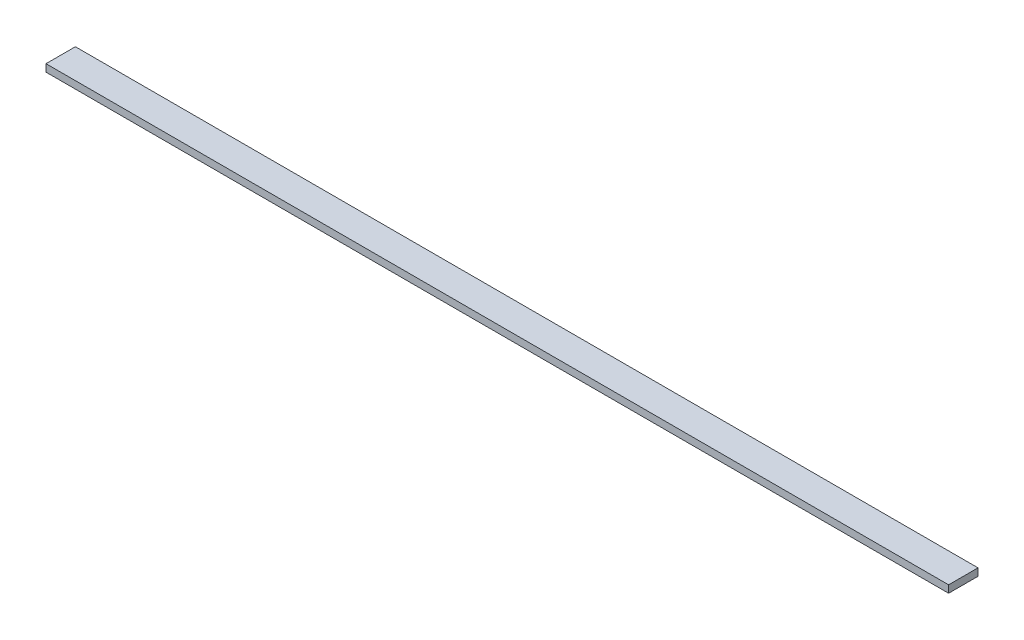
ISO-10303-21;
HEADER;
FILE_DESCRIPTION(('STEP AP214'),'2;1');
FILE_NAME('part.step','',(''),(''),'','','');
FILE_SCHEMA(('AUTOMOTIVE_DESIGN { 1 0 10303 214 1 1 1 1 }'));
ENDSEC;
DATA;
#1=APPLICATION_CONTEXT('core data for automotive mechanical design processes');
#2=APPLICATION_PROTOCOL_DEFINITION('international standard','automotive_design',2000,#1);
#3=PRODUCT_CONTEXT('',#1,'mechanical');
#4=PRODUCT('Part','Part','',(#3));
#5=PRODUCT_RELATED_PRODUCT_CATEGORY('part','',(#4));
#6=PRODUCT_DEFINITION_FORMATION('','',#4);
#7=PRODUCT_DEFINITION_CONTEXT('part definition',#1,'design');
#8=PRODUCT_DEFINITION('design','',#6,#7);
#9=PRODUCT_DEFINITION_SHAPE('','',#8);
#10=(LENGTH_UNIT() NAMED_UNIT(*) SI_UNIT(.MILLI.,.METRE.));
#11=(NAMED_UNIT(*) PLANE_ANGLE_UNIT() SI_UNIT($,.RADIAN.));
#12=(NAMED_UNIT(*) SI_UNIT($,.STERADIAN.) SOLID_ANGLE_UNIT());
#13=UNCERTAINTY_MEASURE_WITH_UNIT(LENGTH_MEASURE(1.E-05),#10,'distance_accuracy_value','');
#14=(GEOMETRIC_REPRESENTATION_CONTEXT(3) GLOBAL_UNCERTAINTY_ASSIGNED_CONTEXT((#13)) GLOBAL_UNIT_ASSIGNED_CONTEXT((#10,
#11,#12)) REPRESENTATION_CONTEXT('',''));
#15=CARTESIAN_POINT('',(0.,0.,0.));
#16=DIRECTION('',(0.,0.,1.));
#17=DIRECTION('',(1.,0.,0.));
#18=AXIS2_PLACEMENT_3D('',#15,#16,#17);
#19=CARTESIAN_POINT('',(292.55,-2.38125,-9.525));
#20=DIRECTION('',(0.,0.,1.));
#21=DIRECTION('',(1.,0.,0.));
#22=AXIS2_PLACEMENT_3D('',#19,#20,#21);
#23=PLANE('',#22);
#24=DIRECTION('',(0.,1.,0.));
#25=VECTOR('',#24,1.);
#26=CARTESIAN_POINT('',(-292.55,-2.38125,-9.525));
#27=LINE('',#26,#25);
#28=CARTESIAN_POINT('',(-292.55,-2.38125,-9.525));
#29=VERTEX_POINT('',#28);
#30=CARTESIAN_POINT('',(-292.55,2.38125,-9.525));
#31=VERTEX_POINT('',#30);
#32=EDGE_CURVE('E102',#29,#31,#27,.T.);
#33=ORIENTED_EDGE('',*,*,#32,.T.);
#34=DIRECTION('',(-1.,0.,0.));
#35=VECTOR('',#34,1.);
#36=CARTESIAN_POINT('',(292.55,2.38125,-9.525));
#37=LINE('',#36,#35);
#38=CARTESIAN_POINT('',(292.55,2.38125,-9.525));
#39=VERTEX_POINT('',#38);
#40=EDGE_CURVE('E11',#39,#31,#37,.T.);
#41=ORIENTED_EDGE('',*,*,#40,.F.);
#42=DIRECTION('',(0.,1.,0.));
#43=VECTOR('',#42,1.);
#44=CARTESIAN_POINT('',(292.55,-2.38125,-9.525));
#45=LINE('',#44,#43);
#46=CARTESIAN_POINT('',(292.55,-2.38125,-9.525));
#47=VERTEX_POINT('',#46);
#48=EDGE_CURVE('E90',#47,#39,#45,.T.);
#49=ORIENTED_EDGE('',*,*,#48,.F.);
#50=DIRECTION('',(-1.,0.,0.));
#51=VECTOR('',#50,1.);
#52=CARTESIAN_POINT('',(292.55,-2.38125,-9.525));
#53=LINE('',#52,#51);
#54=EDGE_CURVE('E98',#47,#29,#53,.T.);
#55=ORIENTED_EDGE('',*,*,#54,.T.);
#56=EDGE_LOOP('',(#33,#41,#49,#55));
#57=FACE_BOUND('',#56,.T.);
#58=ADVANCED_FACE('F39',(#57),#23,.F.);
#59=CARTESIAN_POINT('',(292.55,2.38125,9.525));
#60=DIRECTION('',(0.,-1.,0.));
#61=DIRECTION('',(0.,0.,-1.));
#62=AXIS2_PLACEMENT_3D('',#59,#60,#61);
#63=PLANE('',#62);
#64=DIRECTION('',(0.,0.,1.));
#65=VECTOR('',#64,1.);
#66=CARTESIAN_POINT('',(-292.55,2.38125,9.525));
#67=LINE('',#66,#65);
#68=CARTESIAN_POINT('',(-292.55,2.38125,9.525));
#69=VERTEX_POINT('',#68);
#70=EDGE_CURVE('E94',#31,#69,#67,.T.);
#71=ORIENTED_EDGE('',*,*,#70,.T.);
#72=DIRECTION('',(-1.,0.,0.));
#73=VECTOR('',#72,1.);
#74=CARTESIAN_POINT('',(292.55,2.38125,9.525));
#75=LINE('',#74,#73);
#76=CARTESIAN_POINT('',(292.55,2.38125,9.525));
#77=VERTEX_POINT('',#76);
#78=EDGE_CURVE('E47',#77,#69,#75,.T.);
#79=ORIENTED_EDGE('',*,*,#78,.F.);
#80=DIRECTION('',(0.,0.,1.));
#81=VECTOR('',#80,1.);
#82=CARTESIAN_POINT('',(292.55,2.38125,9.525));
#83=LINE('',#82,#81);
#84=EDGE_CURVE('E85',#39,#77,#83,.T.);
#85=ORIENTED_EDGE('',*,*,#84,.F.);
#86=ORIENTED_EDGE('',*,*,#40,.T.);
#87=EDGE_LOOP('',(#71,#79,#85,#86));
#88=FACE_BOUND('',#87,.T.);
#89=ADVANCED_FACE('F93',(#88),#63,.F.);
#90=CARTESIAN_POINT('',(292.55,-2.38125,9.525));
#91=DIRECTION('',(0.,0.,-1.));
#92=DIRECTION('',(-1.,0.,0.));
#93=AXIS2_PLACEMENT_3D('',#90,#91,#92);
#94=PLANE('',#93);
#95=DIRECTION('',(0.,-1.,0.));
#96=VECTOR('',#95,1.);
#97=CARTESIAN_POINT('',(-292.55,-2.38125,9.525));
#98=LINE('',#97,#96);
#99=CARTESIAN_POINT('',(-292.55,-2.38125,9.525));
#100=VERTEX_POINT('',#99);
#101=EDGE_CURVE('E72',#69,#100,#98,.T.);
#102=ORIENTED_EDGE('',*,*,#101,.T.);
#103=DIRECTION('',(-1.,0.,0.));
#104=VECTOR('',#103,1.);
#105=CARTESIAN_POINT('',(292.55,-2.38125,9.525));
#106=LINE('',#105,#104);
#107=CARTESIAN_POINT('',(292.55,-2.38125,9.525));
#108=VERTEX_POINT('',#107);
#109=EDGE_CURVE('E95',#108,#100,#106,.T.);
#110=ORIENTED_EDGE('',*,*,#109,.F.);
#111=DIRECTION('',(0.,-1.,0.));
#112=VECTOR('',#111,1.);
#113=CARTESIAN_POINT('',(292.55,-2.38125,9.525));
#114=LINE('',#113,#112);
#115=EDGE_CURVE('E88',#77,#108,#114,.T.);
#116=ORIENTED_EDGE('',*,*,#115,.F.);
#117=ORIENTED_EDGE('',*,*,#78,.T.);
#118=EDGE_LOOP('',(#102,#110,#116,#117));
#119=FACE_BOUND('',#118,.T.);
#120=ADVANCED_FACE('F96',(#119),#94,.F.);
#121=CARTESIAN_POINT('',(292.55,-2.38125,9.525));
#122=DIRECTION('',(0.,1.,0.));
#123=DIRECTION('',(0.,0.,1.));
#124=AXIS2_PLACEMENT_3D('',#121,#122,#123);
#125=PLANE('',#124);
#126=DIRECTION('',(0.,0.,-1.));
#127=VECTOR('',#126,1.);
#128=CARTESIAN_POINT('',(-292.55,-2.38125,9.525));
#129=LINE('',#128,#127);
#130=EDGE_CURVE('E78',#100,#29,#129,.T.);
#131=ORIENTED_EDGE('',*,*,#130,.T.);
#132=ORIENTED_EDGE('',*,*,#54,.F.);
#133=DIRECTION('',(0.,0.,-1.));
#134=VECTOR('',#133,1.);
#135=CARTESIAN_POINT('',(292.55,-2.38125,9.525));
#136=LINE('',#135,#134);
#137=EDGE_CURVE('E55',#108,#47,#136,.T.);
#138=ORIENTED_EDGE('',*,*,#137,.F.);
#139=ORIENTED_EDGE('',*,*,#109,.T.);
#140=EDGE_LOOP('',(#131,#132,#138,#139));
#141=FACE_BOUND('',#140,.T.);
#142=ADVANCED_FACE('F109',(#141),#125,.F.);
#143=CARTESIAN_POINT('',(292.55,0.,0.));
#144=DIRECTION('',(-1.,0.,0.));
#145=DIRECTION('',(0.,0.,1.));
#146=AXIS2_PLACEMENT_3D('',#143,#144,#145);
#147=PLANE('',#146);
#148=ORIENTED_EDGE('',*,*,#48,.T.);
#149=ORIENTED_EDGE('',*,*,#84,.T.);
#150=ORIENTED_EDGE('',*,*,#115,.T.);
#151=ORIENTED_EDGE('',*,*,#137,.T.);
#152=EDGE_LOOP('',(#148,#149,#150,#151));
#153=FACE_BOUND('',#152,.T.);
#154=ADVANCED_FACE('F86',(#153),#147,.F.);
#155=CARTESIAN_POINT('',(-292.55,0.,0.));
#156=DIRECTION('',(-1.,0.,0.));
#157=DIRECTION('',(0.,0.,1.));
#158=AXIS2_PLACEMENT_3D('',#155,#156,#157);
#159=PLANE('',#158);
#160=ORIENTED_EDGE('',*,*,#32,.F.);
#161=ORIENTED_EDGE('',*,*,#130,.F.);
#162=ORIENTED_EDGE('',*,*,#101,.F.);
#163=ORIENTED_EDGE('',*,*,#70,.F.);
#164=EDGE_LOOP('',(#160,#161,#162,#163));
#165=FACE_BOUND('',#164,.T.);
#166=ADVANCED_FACE('F112',(#165),#159,.T.);
#167=CLOSED_SHELL('',(#58,#89,#120,#142,#154,#166));
#168=MANIFOLD_SOLID_BREP('B2',#167);
#169=ADVANCED_BREP_SHAPE_REPRESENTATION('',(#18,#168),#14);
#170=SHAPE_DEFINITION_REPRESENTATION(#9,#169);
ENDSEC;
END-ISO-10303-21;
